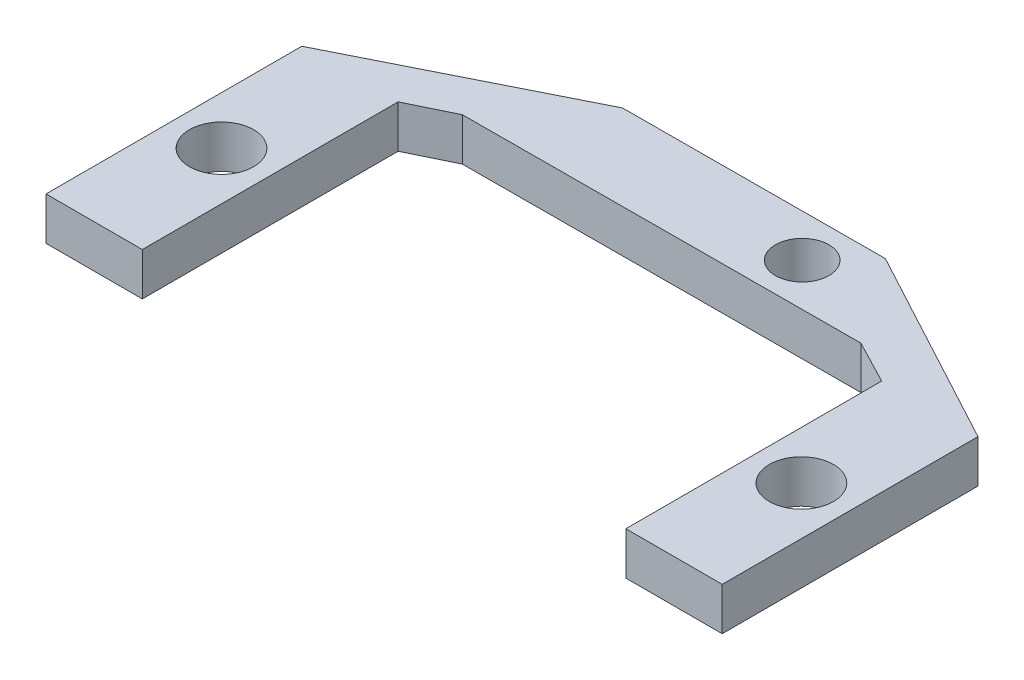
ISO-10303-21;
HEADER;
FILE_DESCRIPTION(('STEP AP214'),'2;1');
FILE_NAME('part.step','',(''),(''),'','','');
FILE_SCHEMA(('AUTOMOTIVE_DESIGN { 1 0 10303 214 1 1 1 1 }'));
ENDSEC;
DATA;
#1=APPLICATION_CONTEXT('core data for automotive mechanical design processes');
#2=APPLICATION_PROTOCOL_DEFINITION('international standard','automotive_design',2000,#1);
#3=PRODUCT_CONTEXT('',#1,'mechanical');
#4=PRODUCT('Part','Part','',(#3));
#5=PRODUCT_RELATED_PRODUCT_CATEGORY('part','',(#4));
#6=PRODUCT_DEFINITION_FORMATION('','',#4);
#7=PRODUCT_DEFINITION_CONTEXT('part definition',#1,'design');
#8=PRODUCT_DEFINITION('design','',#6,#7);
#9=PRODUCT_DEFINITION_SHAPE('','',#8);
#10=(LENGTH_UNIT() NAMED_UNIT(*) SI_UNIT(.MILLI.,.METRE.));
#11=(NAMED_UNIT(*) PLANE_ANGLE_UNIT() SI_UNIT($,.RADIAN.));
#12=(NAMED_UNIT(*) SI_UNIT($,.STERADIAN.) SOLID_ANGLE_UNIT());
#13=UNCERTAINTY_MEASURE_WITH_UNIT(LENGTH_MEASURE(1.E-05),#10,'distance_accuracy_value','');
#14=(GEOMETRIC_REPRESENTATION_CONTEXT(3) GLOBAL_UNCERTAINTY_ASSIGNED_CONTEXT((#13)) GLOBAL_UNIT_ASSIGNED_CONTEXT((#10,
#11,#12)) REPRESENTATION_CONTEXT('',''));
#15=CARTESIAN_POINT('',(0.,0.,0.));
#16=DIRECTION('',(0.,0.,1.));
#17=DIRECTION('',(1.,0.,0.));
#18=AXIS2_PLACEMENT_3D('',#15,#16,#17);
#19=CARTESIAN_POINT('',(0.,2.,0.));
#20=DIRECTION('',(0.,1.,0.));
#21=DIRECTION('',(0.,0.,1.));
#22=AXIS2_PLACEMENT_3D('',#19,#20,#21);
#23=PLANE('',#22);
#24=CARTESIAN_POINT('',(8.27202542162463,2.,-2.7885));
#25=DIRECTION('',(0.,1.,0.));
#26=DIRECTION('',(0.,0.,1.));
#27=AXIS2_PLACEMENT_3D('',#24,#25,#26);
#28=CIRCLE('',#27,1.5);
#29=CARTESIAN_POINT('',(8.27202542162463,2.,-1.2885));
#30=VERTEX_POINT('',#29);
#31=EDGE_CURVE('E294',#30,#30,#28,.T.);
#32=ORIENTED_EDGE('',*,*,#31,.F.);
#33=EDGE_LOOP('',(#32));
#34=FACE_BOUND('',#33,.T.);
#35=DIRECTION('',(0.,0.,1.));
#36=VECTOR('',#35,1.);
#37=CARTESIAN_POINT('',(-21.0679745783754,2.,-8.7885));
#38=LINE('',#37,#36);
#39=CARTESIAN_POINT('',(-21.0679745783754,2.,-8.7885));
#40=VERTEX_POINT('',#39);
#41=CARTESIAN_POINT('',(-21.0679745783754,2.,3.1615));
#42=VERTEX_POINT('',#41);
#43=EDGE_CURVE('E185',#40,#42,#38,.T.);
#44=ORIENTED_EDGE('',*,*,#43,.T.);
#45=DIRECTION('',(1.,0.,0.));
#46=VECTOR('',#45,1.);
#47=CARTESIAN_POINT('',(-21.0679745783754,2.,3.1615));
#48=LINE('',#47,#46);
#49=CARTESIAN_POINT('',(-16.5679745783754,2.,3.1615));
#50=VERTEX_POINT('',#49);
#51=EDGE_CURVE('E113',#42,#50,#48,.T.);
#52=ORIENTED_EDGE('',*,*,#51,.T.);
#53=DIRECTION('',(0.,0.,-1.));
#54=VECTOR('',#53,1.);
#55=CARTESIAN_POINT('',(-16.5679745783754,2.,3.1615));
#56=LINE('',#55,#54);
#57=CARTESIAN_POINT('',(-16.5679745783754,2.,-8.7885));
#58=VERTEX_POINT('',#57);
#59=EDGE_CURVE('E212',#50,#58,#56,.T.);
#60=ORIENTED_EDGE('',*,*,#59,.T.);
#61=DIRECTION('',(0.899708111866115,0.,-0.436492054271679));
#62=VECTOR('',#61,1.);
#63=CARTESIAN_POINT('',(-16.5679745783754,2.,-8.7885));
#64=LINE('',#63,#62);
#65=CARTESIAN_POINT('',(-14.5479745783754,2.,-9.7685));
#66=VERTEX_POINT('',#65);
#67=EDGE_CURVE('E231',#58,#66,#64,.T.);
#68=ORIENTED_EDGE('',*,*,#67,.T.);
#69=DIRECTION('',(0.99999288010452,0.,-0.0037735580381303));
#70=VECTOR('',#69,1.);
#71=CARTESIAN_POINT('',(-14.5479745783754,2.,-9.7685));
#72=LINE('',#71,#70);
#73=CARTESIAN_POINT('',(4.00202542162463,2.,-9.8385));
#74=VERTEX_POINT('',#73);
#75=EDGE_CURVE('E228',#66,#74,#72,.T.);
#76=ORIENTED_EDGE('',*,*,#75,.T.);
#77=DIRECTION('',(0.887288708261766,0.,0.461214427561809));
#78=VECTOR('',#77,1.);
#79=CARTESIAN_POINT('',(6.02202542162463,2.,-8.7885));
#80=LINE('',#79,#78);
#81=CARTESIAN_POINT('',(6.02202542162463,2.,-8.7885));
#82=VERTEX_POINT('',#81);
#83=EDGE_CURVE('E230',#74,#82,#80,.T.);
#84=ORIENTED_EDGE('',*,*,#83,.T.);
#85=DIRECTION('',(0.,0.,1.));
#86=VECTOR('',#85,1.);
#87=CARTESIAN_POINT('',(6.02202542162463,2.,-8.7885));
#88=LINE('',#87,#86);
#89=CARTESIAN_POINT('',(6.02202542162463,2.,3.1615));
#90=VERTEX_POINT('',#89);
#91=EDGE_CURVE('E233',#82,#90,#88,.T.);
#92=ORIENTED_EDGE('',*,*,#91,.T.);
#93=DIRECTION('',(1.,0.,0.));
#94=VECTOR('',#93,1.);
#95=CARTESIAN_POINT('',(6.02202542162463,2.,3.1615));
#96=LINE('',#95,#94);
#97=CARTESIAN_POINT('',(10.5220254216246,2.,3.1615));
#98=VERTEX_POINT('',#97);
#99=EDGE_CURVE('E239',#90,#98,#96,.T.);
#100=ORIENTED_EDGE('',*,*,#99,.T.);
#101=DIRECTION('',(0.,0.,-1.));
#102=VECTOR('',#101,1.);
#103=CARTESIAN_POINT('',(10.5220254216246,2.,3.1615));
#104=LINE('',#103,#102);
#105=CARTESIAN_POINT('',(10.5220254216246,2.,-8.7885));
#106=VERTEX_POINT('',#105);
#107=EDGE_CURVE('E144',#98,#106,#104,.T.);
#108=ORIENTED_EDGE('',*,*,#107,.T.);
#109=DIRECTION('',(-0.880624816389584,0.,-0.473814238661959));
#110=VECTOR('',#109,1.);
#111=CARTESIAN_POINT('',(1.15607013569294,2.,-13.8277890258755));
#112=LINE('',#111,#110);
#113=CARTESIAN_POINT('',(1.15607013569294,2.,-13.8277890258755));
#114=VERTEX_POINT('',#113);
#115=EDGE_CURVE('E138',#106,#114,#112,.T.);
#116=ORIENTED_EDGE('',*,*,#115,.T.);
#117=DIRECTION('',(-0.99999288010452,0.,0.00377355803813035));
#118=VECTOR('',#117,1.);
#119=CARTESIAN_POINT('',(-11.0839298643071,2.,-13.7816003466302));
#120=LINE('',#119,#118);
#121=CARTESIAN_POINT('',(-11.0839298643071,2.,-13.7816003466302));
#122=VERTEX_POINT('',#121);
#123=EDGE_CURVE('E142',#114,#122,#120,.T.);
#124=ORIENTED_EDGE('',*,*,#123,.T.);
#125=DIRECTION('',(-0.894388560370083,0.,0.447290848418712));
#126=VECTOR('',#125,1.);
#127=CARTESIAN_POINT('',(-21.0679745783754,2.,-8.7885));
#128=LINE('',#127,#126);
#129=EDGE_CURVE('E58',#122,#40,#128,.T.);
#130=ORIENTED_EDGE('',*,*,#129,.T.);
#131=EDGE_LOOP('',(#44,#52,#60,#68,#76,#84,#92,#100,#108,#116,#124,#130));
#132=FACE_BOUND('',#131,.T.);
#133=CARTESIAN_POINT('',(-18.8179745783754,2.,-2.7885));
#134=DIRECTION('',(0.,1.,0.));
#135=DIRECTION('',(0.,0.,1.));
#136=AXIS2_PLACEMENT_3D('',#133,#134,#135);
#137=CIRCLE('',#136,1.5);
#138=CARTESIAN_POINT('',(-18.8179745783754,2.,-1.2885));
#139=VERTEX_POINT('',#138);
#140=EDGE_CURVE('E166',#139,#139,#137,.T.);
#141=ORIENTED_EDGE('',*,*,#140,.F.);
#142=EDGE_LOOP('',(#141));
#143=FACE_BOUND('',#142,.T.);
#144=CARTESIAN_POINT('',(-0.723929864307068,2.,-11.8206804463605));
#145=DIRECTION('',(0.,1.,0.));
#146=DIRECTION('',(0.,0.,1.));
#147=AXIS2_PLACEMENT_3D('',#144,#145,#146);
#148=CIRCLE('',#147,1.25);
#149=CARTESIAN_POINT('',(-0.723929864307068,2.,-10.5706804463605));
#150=VERTEX_POINT('',#149);
#151=EDGE_CURVE('E285',#150,#150,#148,.T.);
#152=ORIENTED_EDGE('',*,*,#151,.F.);
#153=EDGE_LOOP('',(#152));
#154=FACE_BOUND('',#153,.T.);
#155=ADVANCED_FACE('F41',(#34,#132,#143,#154),#23,.T.);
#156=CARTESIAN_POINT('',(0.,0.,0.));
#157=DIRECTION('',(0.,1.,0.));
#158=DIRECTION('',(0.,0.,1.));
#159=AXIS2_PLACEMENT_3D('',#156,#157,#158);
#160=PLANE('',#159);
#161=DIRECTION('',(0.,0.,1.));
#162=VECTOR('',#161,1.);
#163=CARTESIAN_POINT('',(-21.0679745783754,0.,-8.7885));
#164=LINE('',#163,#162);
#165=CARTESIAN_POINT('',(-21.0679745783754,0.,-8.7885));
#166=VERTEX_POINT('',#165);
#167=CARTESIAN_POINT('',(-21.0679745783754,0.,3.1615));
#168=VERTEX_POINT('',#167);
#169=EDGE_CURVE('E162',#166,#168,#164,.T.);
#170=ORIENTED_EDGE('',*,*,#169,.F.);
#171=DIRECTION('',(-0.894388560370083,0.,0.447290848418712));
#172=VECTOR('',#171,1.);
#173=CARTESIAN_POINT('',(-21.0679745783754,0.,-8.7885));
#174=LINE('',#173,#172);
#175=CARTESIAN_POINT('',(-11.0839298643071,0.,-13.7816003466302));
#176=VERTEX_POINT('',#175);
#177=EDGE_CURVE('E105',#176,#166,#174,.T.);
#178=ORIENTED_EDGE('',*,*,#177,.F.);
#179=DIRECTION('',(-0.99999288010452,0.,0.00377355803813035));
#180=VECTOR('',#179,1.);
#181=CARTESIAN_POINT('',(-11.0839298643071,0.,-13.7816003466302));
#182=LINE('',#181,#180);
#183=CARTESIAN_POINT('',(1.15607013569294,0.,-13.8277890258755));
#184=VERTEX_POINT('',#183);
#185=EDGE_CURVE('E99',#184,#176,#182,.T.);
#186=ORIENTED_EDGE('',*,*,#185,.F.);
#187=DIRECTION('',(-0.880624816389584,0.,-0.473814238661959));
#188=VECTOR('',#187,1.);
#189=CARTESIAN_POINT('',(1.15607013569294,0.,-13.8277890258755));
#190=LINE('',#189,#188);
#191=CARTESIAN_POINT('',(10.5220254216246,0.,-8.7885));
#192=VERTEX_POINT('',#191);
#193=EDGE_CURVE('E152',#192,#184,#190,.T.);
#194=ORIENTED_EDGE('',*,*,#193,.F.);
#195=DIRECTION('',(0.,0.,-1.));
#196=VECTOR('',#195,1.);
#197=CARTESIAN_POINT('',(10.5220254216246,0.,3.1615));
#198=LINE('',#197,#196);
#199=CARTESIAN_POINT('',(10.5220254216246,0.,3.1615));
#200=VERTEX_POINT('',#199);
#201=EDGE_CURVE('E180',#200,#192,#198,.T.);
#202=ORIENTED_EDGE('',*,*,#201,.F.);
#203=DIRECTION('',(1.,0.,0.));
#204=VECTOR('',#203,1.);
#205=CARTESIAN_POINT('',(6.02202542162463,0.,3.1615));
#206=LINE('',#205,#204);
#207=CARTESIAN_POINT('',(6.02202542162463,0.,3.1615));
#208=VERTEX_POINT('',#207);
#209=EDGE_CURVE('E178',#208,#200,#206,.T.);
#210=ORIENTED_EDGE('',*,*,#209,.F.);
#211=DIRECTION('',(0.,0.,1.));
#212=VECTOR('',#211,1.);
#213=CARTESIAN_POINT('',(6.02202542162463,0.,-8.7885));
#214=LINE('',#213,#212);
#215=CARTESIAN_POINT('',(6.02202542162463,0.,-8.7885));
#216=VERTEX_POINT('',#215);
#217=EDGE_CURVE('E176',#216,#208,#214,.T.);
#218=ORIENTED_EDGE('',*,*,#217,.F.);
#219=DIRECTION('',(0.887288708261766,0.,0.461214427561809));
#220=VECTOR('',#219,1.);
#221=CARTESIAN_POINT('',(6.02202542162463,0.,-8.7885));
#222=LINE('',#221,#220);
#223=CARTESIAN_POINT('',(4.00202542162463,0.,-9.8385));
#224=VERTEX_POINT('',#223);
#225=EDGE_CURVE('E174',#224,#216,#222,.T.);
#226=ORIENTED_EDGE('',*,*,#225,.F.);
#227=DIRECTION('',(0.99999288010452,0.,-0.0037735580381303));
#228=VECTOR('',#227,1.);
#229=CARTESIAN_POINT('',(-14.5479745783754,0.,-9.7685));
#230=LINE('',#229,#228);
#231=CARTESIAN_POINT('',(-14.5479745783754,0.,-9.7685));
#232=VERTEX_POINT('',#231);
#233=EDGE_CURVE('E172',#232,#224,#230,.T.);
#234=ORIENTED_EDGE('',*,*,#233,.F.);
#235=DIRECTION('',(0.899708111866115,0.,-0.436492054271679));
#236=VECTOR('',#235,1.);
#237=CARTESIAN_POINT('',(-16.5679745783754,0.,-8.7885));
#238=LINE('',#237,#236);
#239=CARTESIAN_POINT('',(-16.5679745783754,0.,-8.7885));
#240=VERTEX_POINT('',#239);
#241=EDGE_CURVE('E170',#240,#232,#238,.T.);
#242=ORIENTED_EDGE('',*,*,#241,.F.);
#243=DIRECTION('',(0.,0.,-1.));
#244=VECTOR('',#243,1.);
#245=CARTESIAN_POINT('',(-16.5679745783754,0.,3.1615));
#246=LINE('',#245,#244);
#247=CARTESIAN_POINT('',(-16.5679745783754,0.,3.1615));
#248=VERTEX_POINT('',#247);
#249=EDGE_CURVE('E168',#248,#240,#246,.T.);
#250=ORIENTED_EDGE('',*,*,#249,.F.);
#251=DIRECTION('',(1.,0.,0.));
#252=VECTOR('',#251,1.);
#253=CARTESIAN_POINT('',(-21.0679745783754,0.,3.1615));
#254=LINE('',#253,#252);
#255=EDGE_CURVE('E165',#168,#248,#254,.T.);
#256=ORIENTED_EDGE('',*,*,#255,.F.);
#257=EDGE_LOOP('',(#170,#178,#186,#194,#202,#210,#218,#226,#234,#242,#250,#256));
#258=FACE_BOUND('',#257,.T.);
#259=CARTESIAN_POINT('',(-18.8179745783754,0.,-2.7885));
#260=DIRECTION('',(0.,1.,0.));
#261=DIRECTION('',(0.,0.,1.));
#262=AXIS2_PLACEMENT_3D('',#259,#260,#261);
#263=CIRCLE('',#262,1.5);
#264=CARTESIAN_POINT('',(-18.8179745783754,0.,-1.2885));
#265=VERTEX_POINT('',#264);
#266=EDGE_CURVE('E297',#265,#265,#263,.T.);
#267=ORIENTED_EDGE('',*,*,#266,.T.);
#268=EDGE_LOOP('',(#267));
#269=FACE_BOUND('',#268,.T.);
#270=CARTESIAN_POINT('',(8.27202542162463,0.,-2.7885));
#271=DIRECTION('',(0.,1.,0.));
#272=DIRECTION('',(0.,0.,1.));
#273=AXIS2_PLACEMENT_3D('',#270,#271,#272);
#274=CIRCLE('',#273,1.5);
#275=CARTESIAN_POINT('',(8.27202542162463,0.,-1.2885));
#276=VERTEX_POINT('',#275);
#277=EDGE_CURVE('E291',#276,#276,#274,.T.);
#278=ORIENTED_EDGE('',*,*,#277,.T.);
#279=EDGE_LOOP('',(#278));
#280=FACE_BOUND('',#279,.T.);
#281=CARTESIAN_POINT('',(-0.723929864307068,0.,-11.8206804463605));
#282=DIRECTION('',(0.,1.,0.));
#283=DIRECTION('',(0.,0.,1.));
#284=AXIS2_PLACEMENT_3D('',#281,#282,#283);
#285=CIRCLE('',#284,1.25);
#286=CARTESIAN_POINT('',(-0.723929864307068,0.,-10.5706804463605));
#287=VERTEX_POINT('',#286);
#288=EDGE_CURVE('E288',#287,#287,#285,.T.);
#289=ORIENTED_EDGE('',*,*,#288,.T.);
#290=EDGE_LOOP('',(#289));
#291=FACE_BOUND('',#290,.T.);
#292=ADVANCED_FACE('F216',(#258,#269,#280,#291),#160,.F.);
#293=CARTESIAN_POINT('',(-21.0679745783754,2.,-8.7885));
#294=DIRECTION('',(1.,0.,0.));
#295=DIRECTION('',(0.,0.,-1.));
#296=AXIS2_PLACEMENT_3D('',#293,#294,#295);
#297=PLANE('',#296);
#298=ORIENTED_EDGE('',*,*,#169,.T.);
#299=DIRECTION('',(0.,-1.,0.));
#300=VECTOR('',#299,1.);
#301=CARTESIAN_POINT('',(-21.0679745783754,2.,3.1615));
#302=LINE('',#301,#300);
#303=EDGE_CURVE('E11',#42,#168,#302,.T.);
#304=ORIENTED_EDGE('',*,*,#303,.F.);
#305=ORIENTED_EDGE('',*,*,#43,.F.);
#306=DIRECTION('',(0.,-1.,0.));
#307=VECTOR('',#306,1.);
#308=CARTESIAN_POINT('',(-21.0679745783754,2.,-8.7885));
#309=LINE('',#308,#307);
#310=EDGE_CURVE('E158',#40,#166,#309,.T.);
#311=ORIENTED_EDGE('',*,*,#310,.T.);
#312=EDGE_LOOP('',(#298,#304,#305,#311));
#313=FACE_BOUND('',#312,.T.);
#314=ADVANCED_FACE('F43',(#313),#297,.F.);
#315=CARTESIAN_POINT('',(-21.0679745783754,2.,3.1615));
#316=DIRECTION('',(0.,0.,-1.));
#317=DIRECTION('',(-1.,0.,0.));
#318=AXIS2_PLACEMENT_3D('',#315,#316,#317);
#319=PLANE('',#318);
#320=ORIENTED_EDGE('',*,*,#255,.T.);
#321=DIRECTION('',(0.,-1.,0.));
#322=VECTOR('',#321,1.);
#323=CARTESIAN_POINT('',(-16.5679745783754,2.,3.1615));
#324=LINE('',#323,#322);
#325=EDGE_CURVE('E50',#50,#248,#324,.T.);
#326=ORIENTED_EDGE('',*,*,#325,.F.);
#327=ORIENTED_EDGE('',*,*,#51,.F.);
#328=ORIENTED_EDGE('',*,*,#303,.T.);
#329=EDGE_LOOP('',(#320,#326,#327,#328));
#330=FACE_BOUND('',#329,.T.);
#331=ADVANCED_FACE('F399',(#330),#319,.F.);
#332=CARTESIAN_POINT('',(-16.5679745783754,2.,3.1615));
#333=DIRECTION('',(-1.,0.,0.));
#334=DIRECTION('',(0.,0.,1.));
#335=AXIS2_PLACEMENT_3D('',#332,#333,#334);
#336=PLANE('',#335);
#337=ORIENTED_EDGE('',*,*,#249,.T.);
#338=DIRECTION('',(0.,-1.,0.));
#339=VECTOR('',#338,1.);
#340=CARTESIAN_POINT('',(-16.5679745783754,2.,-8.7885));
#341=LINE('',#340,#339);
#342=EDGE_CURVE('E204',#58,#240,#341,.T.);
#343=ORIENTED_EDGE('',*,*,#342,.F.);
#344=ORIENTED_EDGE('',*,*,#59,.F.);
#345=ORIENTED_EDGE('',*,*,#325,.T.);
#346=EDGE_LOOP('',(#337,#343,#344,#345));
#347=FACE_BOUND('',#346,.T.);
#348=ADVANCED_FACE('F210',(#347),#336,.F.);
#349=CARTESIAN_POINT('',(-16.5679745783754,2.,-8.7885));
#350=DIRECTION('',(-0.436492054271679,0.,-0.899708111866115));
#351=DIRECTION('',(-0.899708111866115,0.,0.436492054271679));
#352=AXIS2_PLACEMENT_3D('',#349,#350,#351);
#353=PLANE('',#352);
#354=ORIENTED_EDGE('',*,*,#241,.T.);
#355=DIRECTION('',(0.,-1.,0.));
#356=VECTOR('',#355,1.);
#357=CARTESIAN_POINT('',(-14.5479745783754,2.,-9.7685));
#358=LINE('',#357,#356);
#359=EDGE_CURVE('E201',#66,#232,#358,.T.);
#360=ORIENTED_EDGE('',*,*,#359,.F.);
#361=ORIENTED_EDGE('',*,*,#67,.F.);
#362=ORIENTED_EDGE('',*,*,#342,.T.);
#363=EDGE_LOOP('',(#354,#360,#361,#362));
#364=FACE_BOUND('',#363,.T.);
#365=ADVANCED_FACE('F222',(#364),#353,.F.);
#366=CARTESIAN_POINT('',(-14.5479745783754,2.,-9.7685));
#367=DIRECTION('',(-0.0037735580381303,0.,-0.99999288010452));
#368=DIRECTION('',(-0.99999288010452,0.,0.0037735580381303));
#369=AXIS2_PLACEMENT_3D('',#366,#367,#368);
#370=PLANE('',#369);
#371=ORIENTED_EDGE('',*,*,#233,.T.);
#372=DIRECTION('',(0.,-1.,0.));
#373=VECTOR('',#372,1.);
#374=CARTESIAN_POINT('',(4.00202542162463,2.,-9.8385));
#375=LINE('',#374,#373);
#376=EDGE_CURVE('E198',#74,#224,#375,.T.);
#377=ORIENTED_EDGE('',*,*,#376,.F.);
#378=ORIENTED_EDGE('',*,*,#75,.F.);
#379=ORIENTED_EDGE('',*,*,#359,.T.);
#380=EDGE_LOOP('',(#371,#377,#378,#379));
#381=FACE_BOUND('',#380,.T.);
#382=ADVANCED_FACE('F226',(#381),#370,.F.);
#383=CARTESIAN_POINT('',(6.02202542162463,2.,-8.7885));
#384=DIRECTION('',(0.461214427561809,0.,-0.887288708261766));
#385=DIRECTION('',(-0.887288708261766,0.,-0.461214427561809));
#386=AXIS2_PLACEMENT_3D('',#383,#384,#385);
#387=PLANE('',#386);
#388=ORIENTED_EDGE('',*,*,#225,.T.);
#389=DIRECTION('',(0.,-1.,0.));
#390=VECTOR('',#389,1.);
#391=CARTESIAN_POINT('',(6.02202542162463,2.,-8.7885));
#392=LINE('',#391,#390);
#393=EDGE_CURVE('E195',#82,#216,#392,.T.);
#394=ORIENTED_EDGE('',*,*,#393,.F.);
#395=ORIENTED_EDGE('',*,*,#83,.F.);
#396=ORIENTED_EDGE('',*,*,#376,.T.);
#397=EDGE_LOOP('',(#388,#394,#395,#396));
#398=FACE_BOUND('',#397,.T.);
#399=ADVANCED_FACE('F364',(#398),#387,.F.);
#400=CARTESIAN_POINT('',(6.02202542162463,2.,-8.7885));
#401=DIRECTION('',(1.,0.,0.));
#402=DIRECTION('',(0.,0.,-1.));
#403=AXIS2_PLACEMENT_3D('',#400,#401,#402);
#404=PLANE('',#403);
#405=ORIENTED_EDGE('',*,*,#217,.T.);
#406=DIRECTION('',(0.,-1.,0.));
#407=VECTOR('',#406,1.);
#408=CARTESIAN_POINT('',(6.02202542162463,2.,3.1615));
#409=LINE('',#408,#407);
#410=EDGE_CURVE('E192',#90,#208,#409,.T.);
#411=ORIENTED_EDGE('',*,*,#410,.F.);
#412=ORIENTED_EDGE('',*,*,#91,.F.);
#413=ORIENTED_EDGE('',*,*,#393,.T.);
#414=EDGE_LOOP('',(#405,#411,#412,#413));
#415=FACE_BOUND('',#414,.T.);
#416=ADVANCED_FACE('F355',(#415),#404,.F.);
#417=CARTESIAN_POINT('',(6.02202542162463,2.,3.1615));
#418=DIRECTION('',(0.,0.,-1.));
#419=DIRECTION('',(-1.,0.,0.));
#420=AXIS2_PLACEMENT_3D('',#417,#418,#419);
#421=PLANE('',#420);
#422=ORIENTED_EDGE('',*,*,#209,.T.);
#423=DIRECTION('',(0.,-1.,0.));
#424=VECTOR('',#423,1.);
#425=CARTESIAN_POINT('',(10.5220254216246,2.,3.1615));
#426=LINE('',#425,#424);
#427=EDGE_CURVE('E189',#98,#200,#426,.T.);
#428=ORIENTED_EDGE('',*,*,#427,.F.);
#429=ORIENTED_EDGE('',*,*,#99,.F.);
#430=ORIENTED_EDGE('',*,*,#410,.T.);
#431=EDGE_LOOP('',(#422,#428,#429,#430));
#432=FACE_BOUND('',#431,.T.);
#433=ADVANCED_FACE('F245',(#432),#421,.F.);
#434=CARTESIAN_POINT('',(10.5220254216246,2.,3.1615));
#435=DIRECTION('',(-1.,0.,0.));
#436=DIRECTION('',(0.,0.,1.));
#437=AXIS2_PLACEMENT_3D('',#434,#435,#436);
#438=PLANE('',#437);
#439=ORIENTED_EDGE('',*,*,#201,.T.);
#440=DIRECTION('',(0.,-1.,0.));
#441=VECTOR('',#440,1.);
#442=CARTESIAN_POINT('',(10.5220254216246,2.,-8.7885));
#443=LINE('',#442,#441);
#444=EDGE_CURVE('E153',#106,#192,#443,.T.);
#445=ORIENTED_EDGE('',*,*,#444,.F.);
#446=ORIENTED_EDGE('',*,*,#107,.F.);
#447=ORIENTED_EDGE('',*,*,#427,.T.);
#448=EDGE_LOOP('',(#439,#445,#446,#447));
#449=FACE_BOUND('',#448,.T.);
#450=ADVANCED_FACE('F249',(#449),#438,.F.);
#451=CARTESIAN_POINT('',(1.15607013569294,2.,-13.8277890258755));
#452=DIRECTION('',(-0.473814238661959,0.,0.880624816389584));
#453=DIRECTION('',(0.880624816389584,0.,0.473814238661959));
#454=AXIS2_PLACEMENT_3D('',#451,#452,#453);
#455=PLANE('',#454);
#456=ORIENTED_EDGE('',*,*,#193,.T.);
#457=DIRECTION('',(0.,-1.,0.));
#458=VECTOR('',#457,1.);
#459=CARTESIAN_POINT('',(1.15607013569294,2.,-13.8277890258755));
#460=LINE('',#459,#458);
#461=EDGE_CURVE('E149',#114,#184,#460,.T.);
#462=ORIENTED_EDGE('',*,*,#461,.F.);
#463=ORIENTED_EDGE('',*,*,#115,.F.);
#464=ORIENTED_EDGE('',*,*,#444,.T.);
#465=EDGE_LOOP('',(#456,#462,#463,#464));
#466=FACE_BOUND('',#465,.T.);
#467=ADVANCED_FACE('F150',(#466),#455,.F.);
#468=CARTESIAN_POINT('',(-11.0839298643071,2.,-13.7816003466302));
#469=DIRECTION('',(0.00377355803813035,0.,0.99999288010452));
#470=DIRECTION('',(0.99999288010452,0.,-0.00377355803813035));
#471=AXIS2_PLACEMENT_3D('',#468,#469,#470);
#472=PLANE('',#471);
#473=ORIENTED_EDGE('',*,*,#185,.T.);
#474=DIRECTION('',(0.,-1.,0.));
#475=VECTOR('',#474,1.);
#476=CARTESIAN_POINT('',(-11.0839298643071,2.,-13.7816003466302));
#477=LINE('',#476,#475);
#478=EDGE_CURVE('E154',#122,#176,#477,.T.);
#479=ORIENTED_EDGE('',*,*,#478,.F.);
#480=ORIENTED_EDGE('',*,*,#123,.F.);
#481=ORIENTED_EDGE('',*,*,#461,.T.);
#482=EDGE_LOOP('',(#473,#479,#480,#481));
#483=FACE_BOUND('',#482,.T.);
#484=ADVANCED_FACE('F156',(#483),#472,.F.);
#485=CARTESIAN_POINT('',(-21.0679745783754,2.,-8.7885));
#486=DIRECTION('',(0.447290848418712,0.,0.894388560370083));
#487=DIRECTION('',(0.894388560370083,0.,-0.447290848418712));
#488=AXIS2_PLACEMENT_3D('',#485,#486,#487);
#489=PLANE('',#488);
#490=ORIENTED_EDGE('',*,*,#177,.T.);
#491=ORIENTED_EDGE('',*,*,#310,.F.);
#492=ORIENTED_EDGE('',*,*,#129,.F.);
#493=ORIENTED_EDGE('',*,*,#478,.T.);
#494=EDGE_LOOP('',(#490,#491,#492,#493));
#495=FACE_BOUND('',#494,.T.);
#496=ADVANCED_FACE('F253',(#495),#489,.F.);
#497=CARTESIAN_POINT('',(-18.8179745783754,2.,-2.7885));
#498=DIRECTION('',(0.,-1.,0.));
#499=DIRECTION('',(0.,0.,-1.));
#500=AXIS2_PLACEMENT_3D('',#497,#498,#499);
#501=CYLINDRICAL_SURFACE('',#500,1.5);
#502=ORIENTED_EDGE('',*,*,#140,.T.);
#503=EDGE_LOOP('',(#502));
#504=FACE_BOUND('',#503,.T.);
#505=ORIENTED_EDGE('',*,*,#266,.F.);
#506=EDGE_LOOP('',(#505));
#507=FACE_BOUND('',#506,.T.);
#508=ADVANCED_FACE('F255',(#504,#507),#501,.F.);
#509=CARTESIAN_POINT('',(8.27202542162463,2.,-2.7885));
#510=DIRECTION('',(0.,-1.,0.));
#511=DIRECTION('',(0.,0.,-1.));
#512=AXIS2_PLACEMENT_3D('',#509,#510,#511);
#513=CYLINDRICAL_SURFACE('',#512,1.5);
#514=ORIENTED_EDGE('',*,*,#31,.T.);
#515=EDGE_LOOP('',(#514));
#516=FACE_BOUND('',#515,.T.);
#517=ORIENTED_EDGE('',*,*,#277,.F.);
#518=EDGE_LOOP('',(#517));
#519=FACE_BOUND('',#518,.T.);
#520=ADVANCED_FACE('F261',(#516,#519),#513,.F.);
#521=CARTESIAN_POINT('',(-0.723929864307068,2.,-11.8206804463605));
#522=DIRECTION('',(0.,-1.,0.));
#523=DIRECTION('',(0.,0.,-1.));
#524=AXIS2_PLACEMENT_3D('',#521,#522,#523);
#525=CYLINDRICAL_SURFACE('',#524,1.25);
#526=ORIENTED_EDGE('',*,*,#151,.T.);
#527=EDGE_LOOP('',(#526));
#528=FACE_BOUND('',#527,.T.);
#529=ORIENTED_EDGE('',*,*,#288,.F.);
#530=EDGE_LOOP('',(#529));
#531=FACE_BOUND('',#530,.T.);
#532=ADVANCED_FACE('F276',(#528,#531),#525,.F.);
#533=CLOSED_SHELL('',(#155,#292,#314,#331,#348,#365,#382,#399,#416,#433,#450,#467,#484,#496,
#508,#520,#532));
#534=MANIFOLD_SOLID_BREP('B2',#533);
#535=ADVANCED_BREP_SHAPE_REPRESENTATION('',(#18,#534),#14);
#536=SHAPE_DEFINITION_REPRESENTATION(#9,#535);
ENDSEC;
END-ISO-10303-21;
